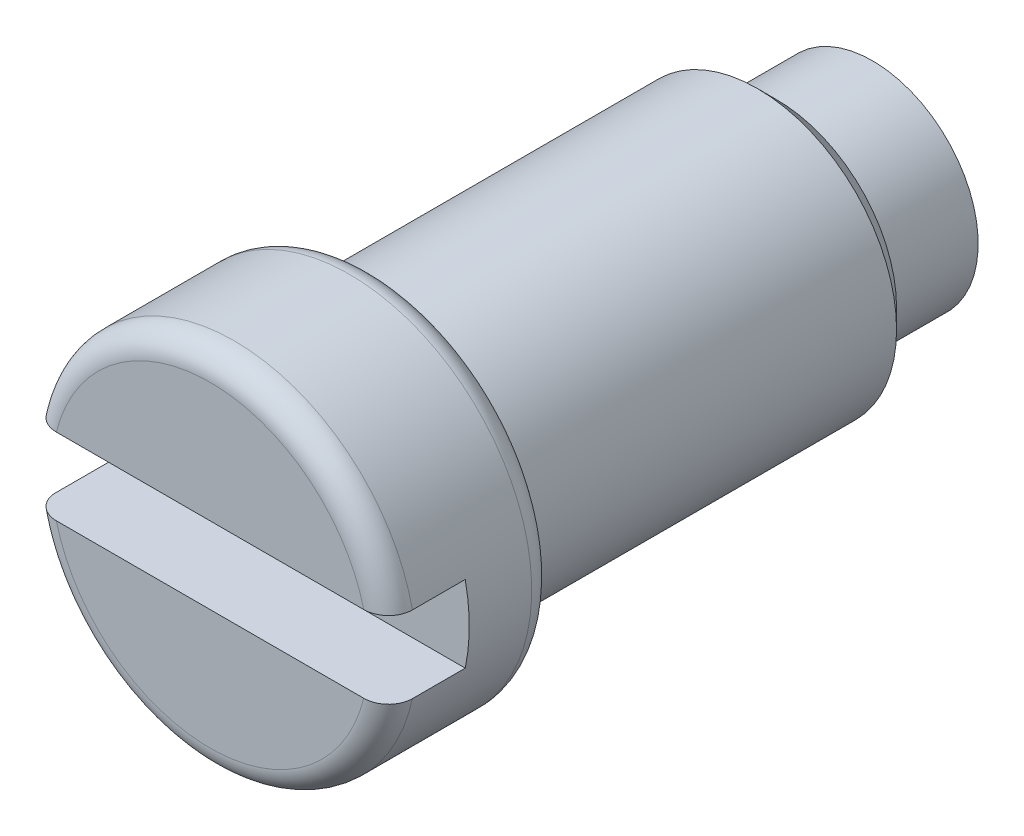
ISO-10303-21;
HEADER;
FILE_DESCRIPTION(('STEP AP214'),'2;1');
FILE_NAME('part.step','',(''),(''),'','','');
FILE_SCHEMA(('AUTOMOTIVE_DESIGN { 1 0 10303 214 1 1 1 1 }'));
ENDSEC;
DATA;
#1=APPLICATION_CONTEXT('core data for automotive mechanical design processes');
#2=APPLICATION_PROTOCOL_DEFINITION('international standard','automotive_design',2000,#1);
#3=PRODUCT_CONTEXT('',#1,'mechanical');
#4=PRODUCT('Part','Part','',(#3));
#5=PRODUCT_RELATED_PRODUCT_CATEGORY('part','',(#4));
#6=PRODUCT_DEFINITION_FORMATION('','',#4);
#7=PRODUCT_DEFINITION_CONTEXT('part definition',#1,'design');
#8=PRODUCT_DEFINITION('design','',#6,#7);
#9=PRODUCT_DEFINITION_SHAPE('','',#8);
#10=(LENGTH_UNIT() NAMED_UNIT(*) SI_UNIT(.MILLI.,.METRE.));
#11=(NAMED_UNIT(*) PLANE_ANGLE_UNIT() SI_UNIT($,.RADIAN.));
#12=(NAMED_UNIT(*) SI_UNIT($,.STERADIAN.) SOLID_ANGLE_UNIT());
#13=UNCERTAINTY_MEASURE_WITH_UNIT(LENGTH_MEASURE(1.E-05),#10,'distance_accuracy_value','');
#14=(GEOMETRIC_REPRESENTATION_CONTEXT(3) GLOBAL_UNCERTAINTY_ASSIGNED_CONTEXT((#13)) GLOBAL_UNIT_ASSIGNED_CONTEXT((#10,
#11,#12)) REPRESENTATION_CONTEXT('',''));
#15=CARTESIAN_POINT('',(0.,0.,0.));
#16=DIRECTION('',(0.,0.,1.));
#17=DIRECTION('',(1.,0.,0.));
#18=AXIS2_PLACEMENT_3D('',#15,#16,#17);
#19=CARTESIAN_POINT('',(-2.5,4.6,9.513026051264));
#20=DIRECTION('',(0.,0.,-1.));
#21=DIRECTION('',(-1.,0.,0.));
#22=AXIS2_PLACEMENT_3D('',#19,#20,#21);
#23=PLANE('',#22);
#24=CARTESIAN_POINT('',(-2.5,4.6,9.513026051264));
#25=DIRECTION('',(0.,0.,-1.));
#26=DIRECTION('',(-1.,0.,0.));
#27=AXIS2_PLACEMENT_3D('',#24,#25,#26);
#28=CIRCLE('',#27,1.9);
#29=CARTESIAN_POINT('',(-0.642582437899165,5.,9.513026051264));
#30=VERTEX_POINT('',#29);
#31=CARTESIAN_POINT('',(-0.642582437899165,4.2,9.513026051264));
#32=VERTEX_POINT('',#31);
#33=EDGE_CURVE('E85',#30,#32,#28,.T.);
#34=ORIENTED_EDGE('',*,*,#33,.F.);
#35=DIRECTION('',(1.,0.,0.));
#36=VECTOR('',#35,1.);
#37=CARTESIAN_POINT('',(-4.5,5.,9.513026051264));
#38=LINE('',#37,#36);
#39=CARTESIAN_POINT('',(-4.35741756210084,5.,9.513026051264));
#40=VERTEX_POINT('',#39);
#41=EDGE_CURVE('E87',#40,#30,#38,.T.);
#42=ORIENTED_EDGE('',*,*,#41,.F.);
#43=CARTESIAN_POINT('',(-2.5,4.6,9.513026051264));
#44=DIRECTION('',(0.,0.,-1.));
#45=DIRECTION('',(-1.,0.,0.));
#46=AXIS2_PLACEMENT_3D('',#43,#44,#45);
#47=CIRCLE('',#46,1.9);
#48=CARTESIAN_POINT('',(-4.35741756210084,4.2,9.513026051264));
#49=VERTEX_POINT('',#48);
#50=EDGE_CURVE('E20',#49,#40,#47,.T.);
#51=ORIENTED_EDGE('',*,*,#50,.F.);
#52=DIRECTION('',(-1.,0.,0.));
#53=VECTOR('',#52,1.);
#54=CARTESIAN_POINT('',(-0.5,4.2,9.513026051264));
#55=LINE('',#54,#53);
#56=EDGE_CURVE('E107',#32,#49,#55,.T.);
#57=ORIENTED_EDGE('',*,*,#56,.F.);
#58=EDGE_LOOP('',(#34,#42,#51,#57));
#59=FACE_BOUND('',#58,.T.);
#60=ADVANCED_FACE('F16',(#59),#23,.F.);
#61=CARTESIAN_POINT('',(-0.5,4.2,9.513026051264));
#62=DIRECTION('',(0.,1.,0.));
#63=DIRECTION('',(-1.,0.,0.));
#64=AXIS2_PLACEMENT_3D('',#61,#62,#63);
#65=PLANE('',#64);
#66=CARTESIAN_POINT('',(-0.899218940641806,4.2,10.3130260512637));
#67=CARTESIAN_POINT('',(-0.88447312314856,4.2,10.313037144346));
#68=CARTESIAN_POINT('',(-0.869726664546941,4.2,10.3117986365551));
#69=CARTESIAN_POINT('',(-0.840641662037422,4.2,10.3068872802437));
#70=CARTESIAN_POINT('',(-0.826303207865821,4.2,10.303213900449));
#71=CARTESIAN_POINT('',(-0.79843701500635,4.2,10.2934931109897));
#72=CARTESIAN_POINT('',(-0.784910057216155,4.2,10.2874434555903));
#73=CARTESIAN_POINT('',(-0.759094263590366,4.2,10.2731233730628));
#74=CARTESIAN_POINT('',(-0.746804813265735,4.2,10.2648540556689));
#75=CARTESIAN_POINT('',(-0.724038752934265,4.2,10.2464697612604));
#76=CARTESIAN_POINT('',(-0.713534804318365,4.2,10.236388660097));
#77=CARTESIAN_POINT('',(-0.694419251669464,4.2,10.2145623590513));
#78=CARTESIAN_POINT('',(-0.685807943175291,4.2,10.202816899747));
#79=CARTESIAN_POINT('',(-0.670952806041116,4.2,10.1783164280296));
#80=CARTESIAN_POINT('',(-0.664655221086468,4.2,10.16559395529));
#81=CARTESIAN_POINT('',(-0.654338662829457,4.2,10.1392621516275));
#82=CARTESIAN_POINT('',(-0.650317565097668,4.2,10.1256536608115));
#83=CARTESIAN_POINT('',(-0.645864357957129,4.2,10.1037824776998));
#84=CARTESIAN_POINT('',(-0.644634227561519,4.2,10.0956741556066));
#85=CARTESIAN_POINT('',(-0.642993586780836,4.2,10.0793872042961));
#86=CARTESIAN_POINT('',(-0.642581861490174,4.2,10.0712086974215));
#87=CARTESIAN_POINT('',(-0.642582437898781,4.2,10.0630260512636));
#88=B_SPLINE_CURVE_WITH_KNOTS('',3,(#66,#67,#68,#69,#70,#71,#72,#73,#74,#75,#76,#77,#78,#79,#80,
#81,#82,#83,#84,#85,#86,#87),.UNSPECIFIED.,.F.,.F.,(4,2,2,2,2,2,2,2,2,2,4),(0.,
0.044186933149632,0.0883835107904894,0.132621957953736,0.176838328888893,0.220300739142021,
0.263769931306879,0.3061534845631,0.348497419797681,0.373063391031489,0.397592867268908),.UNSPECIFIED.);
#89=CARTESIAN_POINT('',(-0.899218940641903,4.2,10.3130260512637));
#90=VERTEX_POINT('',#89);
#91=CARTESIAN_POINT('',(-0.642582437899165,4.2,10.063026051264));
#92=VERTEX_POINT('',#91);
#93=EDGE_CURVE('E105',#90,#92,#88,.T.);
#94=ORIENTED_EDGE('',*,*,#93,.T.);
#95=DIRECTION('',(0.,0.,1.));
#96=VECTOR('',#95,1.);
#97=CARTESIAN_POINT('',(-0.642582437899,4.2,9.513026051264));
#98=LINE('',#97,#96);
#99=EDGE_CURVE('E98',#92,#32,#98,.F.);
#100=ORIENTED_EDGE('',*,*,#99,.T.);
#101=ORIENTED_EDGE('',*,*,#56,.T.);
#102=DIRECTION('',(0.,0.,1.));
#103=VECTOR('',#102,1.);
#104=CARTESIAN_POINT('',(-4.357417562101,4.2,9.513026051264));
#105=LINE('',#104,#103);
#106=CARTESIAN_POINT('',(-4.35741756210088,4.2,10.0630260512635));
#107=VERTEX_POINT('',#106);
#108=EDGE_CURVE('E81',#49,#107,#105,.T.);
#109=ORIENTED_EDGE('',*,*,#108,.T.);
#110=CARTESIAN_POINT('',(-4.35741756210075,4.2,10.063026051263));
#111=CARTESIAN_POINT('',(-4.35743064349662,4.2,10.0768534439318));
#112=CARTESIAN_POINT('',(-4.35624491994685,4.2,10.0906756402485));
#113=CARTESIAN_POINT('',(-4.35157430283897,4.2,10.1179073219119));
#114=CARTESIAN_POINT('',(-4.34809255191639,4.2,10.1313173451905));
#115=CARTESIAN_POINT('',(-4.33892651719286,4.2,10.1573659647133));
#116=CARTESIAN_POINT('',(-4.33324160193866,4.2,10.1700043385904));
#117=CARTESIAN_POINT('',(-4.31985000896061,4.2,10.1941581758333));
#118=CARTESIAN_POINT('',(-4.31214336384667,4.2,10.2056736573069));
#119=CARTESIAN_POINT('',(-4.29486257387961,4.2,10.2273730850821));
#120=CARTESIAN_POINT('',(-4.28527245531423,4.2,10.2375443010645));
#121=CARTESIAN_POINT('',(-4.26455140863786,4.2,10.2561745008366));
#122=CARTESIAN_POINT('',(-4.2534201697458,4.2,10.2646331384198));
#123=CARTESIAN_POINT('',(-4.22968085064145,4.2,10.2797941125335));
#124=CARTESIAN_POINT('',(-4.21704608856897,4.2,10.286454618718));
#125=CARTESIAN_POINT('',(-4.19085734578955,4.2,10.2976174026561));
#126=CARTESIAN_POINT('',(-4.17730350910966,4.2,10.3021200176822));
#127=CARTESIAN_POINT('',(-4.15322235167703,4.2,10.3080010555842));
#128=CARTESIAN_POINT('',(-4.14281531442657,4.2,10.3098855908445));
#129=CARTESIAN_POINT('',(-4.12186674090448,4.2,10.3123980618592));
#130=CARTESIAN_POINT('',(-4.11132543509076,4.2,10.3130279181494));
#131=CARTESIAN_POINT('',(-4.10078105935821,4.2,10.3130260512637));
#132=B_SPLINE_CURVE_WITH_KNOTS('',3,(#110,#111,#112,#113,#114,#115,#116,#117,#118,#119,#120,
#121,#122,#123,#124,#125,#126,#127,#128,#129,#130,#131),.UNSPECIFIED.,.F.,.F.,(4,2,2,2,2,2,2,2,
2,2,4),(0.,0.0414236728606154,0.0827907653599118,0.124169722941349,0.165548013133184,
0.207293695140768,0.249047807843514,0.291702781648335,0.334351086424403,0.366007673767764,
0.397615767053144),.UNSPECIFIED.);
#133=CARTESIAN_POINT('',(-4.10078105935828,4.2,10.3130260512637));
#134=VERTEX_POINT('',#133);
#135=EDGE_CURVE('E106',#107,#134,#132,.T.);
#136=ORIENTED_EDGE('',*,*,#135,.T.);
#137=DIRECTION('',(-1.,0.,0.));
#138=VECTOR('',#137,1.);
#139=CARTESIAN_POINT('',(-2.5,4.2,10.313026051264));
#140=LINE('',#139,#138);
#141=EDGE_CURVE('E137',#134,#90,#140,.F.);
#142=ORIENTED_EDGE('',*,*,#141,.T.);
#143=EDGE_LOOP('',(#94,#100,#101,#109,#136,#142));
#144=FACE_BOUND('',#143,.T.);
#145=ADVANCED_FACE('F167',(#144),#65,.T.);
#146=CARTESIAN_POINT('',(-4.5,5.,9.513026051264));
#147=DIRECTION('',(0.,-1.,0.));
#148=DIRECTION('',(1.,0.,0.));
#149=AXIS2_PLACEMENT_3D('',#146,#147,#148);
#150=PLANE('',#149);
#151=CARTESIAN_POINT('',(-0.64258243790062,5.,10.063026051264));
#152=CARTESIAN_POINT('',(-0.642569356504808,5.,10.0768534439328));
#153=CARTESIAN_POINT('',(-0.643755080054645,5.,10.0906756402496));
#154=CARTESIAN_POINT('',(-0.648425697162642,5.,10.117907321913));
#155=CARTESIAN_POINT('',(-0.651907448085279,5.,10.1313173451915));
#156=CARTESIAN_POINT('',(-0.661073482808934,5.,10.1573659647144));
#157=CARTESIAN_POINT('',(-0.666758398063187,5.,10.1700043385915));
#158=CARTESIAN_POINT('',(-0.680149991041358,5.,10.1941581758343));
#159=CARTESIAN_POINT('',(-0.687856636155357,5.,10.2056736573079));
#160=CARTESIAN_POINT('',(-0.705137426122528,5.,10.227373085083));
#161=CARTESIAN_POINT('',(-0.714727544687964,5.,10.2375443010655));
#162=CARTESIAN_POINT('',(-0.735448591364448,5.,10.2561745008375));
#163=CARTESIAN_POINT('',(-0.746579830256557,5.,10.2646331384206));
#164=CARTESIAN_POINT('',(-0.770319149361005,5.,10.2797941125343));
#165=CARTESIAN_POINT('',(-0.782953911433531,5.,10.2864546187187));
#166=CARTESIAN_POINT('',(-0.809142654213031,5.,10.2976174026568));
#167=CARTESIAN_POINT('',(-0.822696490892963,5.,10.3021200176828));
#168=CARTESIAN_POINT('',(-0.84677764832523,5.,10.3080010555846));
#169=CARTESIAN_POINT('',(-0.85718468557528,5.,10.3098855908449));
#170=CARTESIAN_POINT('',(-0.878133259096544,5.,10.3123980618594));
#171=CARTESIAN_POINT('',(-0.888674564909842,5.,10.3130279181497));
#172=CARTESIAN_POINT('',(-0.89921894064198,5.,10.313026051264));
#173=B_SPLINE_CURVE_WITH_KNOTS('',3,(#151,#152,#153,#154,#155,#156,#157,#158,#159,#160,#161,
#162,#163,#164,#165,#166,#167,#168,#169,#170,#171,#172),.UNSPECIFIED.,.F.,.F.,(4,2,2,2,2,2,2,2,
2,2,4),(0.,0.0414236728606735,0.0827907653600285,0.124169722941522,0.165548013133419,
0.207293695141062,0.249047807843868,0.29170278164875,0.334351086424873,0.366007673766991,
0.397615767051126),.UNSPECIFIED.);
#174=CARTESIAN_POINT('',(-0.64258243789981,5.,10.063026051264));
#175=VERTEX_POINT('',#174);
#176=CARTESIAN_POINT('',(-0.899218940642508,5.,10.313026051264));
#177=VERTEX_POINT('',#176);
#178=EDGE_CURVE('E132',#175,#177,#173,.T.);
#179=ORIENTED_EDGE('',*,*,#178,.T.);
#180=DIRECTION('',(-1.,0.,0.));
#181=VECTOR('',#180,1.);
#182=CARTESIAN_POINT('',(-2.5,5.,10.313026051264));
#183=LINE('',#182,#181);
#184=CARTESIAN_POINT('',(-4.10078105935801,5.,10.3130260512639));
#185=VERTEX_POINT('',#184);
#186=EDGE_CURVE('E131',#177,#185,#183,.T.);
#187=ORIENTED_EDGE('',*,*,#186,.T.);
#188=CARTESIAN_POINT('',(-4.10078105935802,5.,10.3130260512639));
#189=CARTESIAN_POINT('',(-4.11552687685127,5.,10.3130371443462));
#190=CARTESIAN_POINT('',(-4.13027333545289,5.,10.3117986365553));
#191=CARTESIAN_POINT('',(-4.15935833796241,5.,10.3068872802438));
#192=CARTESIAN_POINT('',(-4.17369679213401,5.,10.3032139004491));
#193=CARTESIAN_POINT('',(-4.20156298499348,5.,10.2934931109898));
#194=CARTESIAN_POINT('',(-4.21508994278367,5.,10.2874434555903));
#195=CARTESIAN_POINT('',(-4.24090573640945,5.,10.2731233730628));
#196=CARTESIAN_POINT('',(-4.25319518673408,5.,10.2648540556689));
#197=CARTESIAN_POINT('',(-4.27596124706553,5.,10.2464697612604));
#198=CARTESIAN_POINT('',(-4.28646519568143,5.,10.236388660097));
#199=CARTESIAN_POINT('',(-4.30558074833031,5.,10.2145623590512));
#200=CARTESIAN_POINT('',(-4.31419205682448,5.,10.2028168997469));
#201=CARTESIAN_POINT('',(-4.32904719395864,5.,10.1783164280295));
#202=CARTESIAN_POINT('',(-4.33534477891327,5.,10.1655939552899));
#203=CARTESIAN_POINT('',(-4.34566133717027,5.,10.1392621516273));
#204=CARTESIAN_POINT('',(-4.34968243490205,5.,10.1256536608114));
#205=CARTESIAN_POINT('',(-4.35413564204254,5.,10.1037824776997));
#206=CARTESIAN_POINT('',(-4.35536577243813,5.,10.0956741556066));
#207=CARTESIAN_POINT('',(-4.3570064132188,5.,10.0793872042964));
#208=CARTESIAN_POINT('',(-4.35741813850947,5.,10.0712086974219));
#209=CARTESIAN_POINT('',(-4.35741756210088,5.,10.0630260512641));
#210=B_SPLINE_CURVE_WITH_KNOTS('',3,(#188,#189,#190,#191,#192,#193,#194,#195,#196,#197,#198,
#199,#200,#201,#202,#203,#204,#205,#206,#207,#208,#209),.UNSPECIFIED.,.F.,.F.,(4,2,2,2,2,2,2,2,
2,2,4),(0.,0.0441869331496441,0.0883835107905131,0.132621957953773,0.17683832888894,
0.220300739142085,0.26376993130696,0.306153484563207,0.348497419797815,0.373063391031278,
0.397592867268352),.UNSPECIFIED.);
#211=CARTESIAN_POINT('',(-4.35741756210084,5.,10.063026051264));
#212=VERTEX_POINT('',#211);
#213=EDGE_CURVE('E96',#185,#212,#210,.T.);
#214=ORIENTED_EDGE('',*,*,#213,.T.);
#215=DIRECTION('',(0.,0.,1.));
#216=VECTOR('',#215,1.);
#217=CARTESIAN_POINT('',(-4.357417562101,5.,9.513026051264));
#218=LINE('',#217,#216);
#219=EDGE_CURVE('E77',#212,#40,#218,.F.);
#220=ORIENTED_EDGE('',*,*,#219,.T.);
#221=ORIENTED_EDGE('',*,*,#41,.T.);
#222=DIRECTION('',(0.,0.,1.));
#223=VECTOR('',#222,1.);
#224=CARTESIAN_POINT('',(-0.642582437899,5.,9.513026051264));
#225=LINE('',#224,#223);
#226=EDGE_CURVE('E91',#30,#175,#225,.T.);
#227=ORIENTED_EDGE('',*,*,#226,.T.);
#228=EDGE_LOOP('',(#179,#187,#214,#220,#221,#227));
#229=FACE_BOUND('',#228,.T.);
#230=ADVANCED_FACE('F93',(#229),#150,.T.);
#231=CARTESIAN_POINT('',(-2.5,4.6,10.313026051264));
#232=DIRECTION('',(0.,0.,-1.));
#233=DIRECTION('',(-1.,0.,0.));
#234=AXIS2_PLACEMENT_3D('',#231,#232,#233);
#235=PLANE('',#234);
#236=CARTESIAN_POINT('',(-2.49999999999999,4.60000000000019,10.3130260512637));
#237=DIRECTION('',(0.,0.,-1.));
#238=DIRECTION('',(-1.,0.,0.));
#239=AXIS2_PLACEMENT_3D('',#236,#237,#238);
#240=CIRCLE('',#239,1.65000000000019);
#241=EDGE_CURVE('E128',#90,#134,#240,.T.);
#242=ORIENTED_EDGE('',*,*,#241,.F.);
#243=ORIENTED_EDGE('',*,*,#141,.F.);
#244=EDGE_LOOP('',(#242,#243));
#245=FACE_BOUND('',#244,.T.);
#246=ADVANCED_FACE('F177',(#245),#235,.F.);
#247=CARTESIAN_POINT('',(-2.5,4.6,10.313026051264));
#248=DIRECTION('',(0.,0.,-1.));
#249=DIRECTION('',(-1.,0.,0.));
#250=AXIS2_PLACEMENT_3D('',#247,#248,#249);
#251=PLANE('',#250);
#252=CARTESIAN_POINT('',(-2.5,4.6000000000016,10.313026051264));
#253=DIRECTION('',(0.,0.,-1.));
#254=DIRECTION('',(-1.,0.,0.));
#255=AXIS2_PLACEMENT_3D('',#252,#253,#254);
#256=CIRCLE('',#255,1.6499999999984);
#257=EDGE_CURVE('E124',#185,#177,#256,.T.);
#258=ORIENTED_EDGE('',*,*,#257,.F.);
#259=ORIENTED_EDGE('',*,*,#186,.F.);
#260=EDGE_LOOP('',(#258,#259));
#261=FACE_BOUND('',#260,.T.);
#262=ADVANCED_FACE('F157',(#261),#251,.F.);
#263=CARTESIAN_POINT('',(-2.49999999999999,4.60000000000019,10.063026051264));
#264=DIRECTION('',(0.,0.,-1.));
#265=DIRECTION('',(-1.,0.,0.));
#266=AXIS2_PLACEMENT_3D('',#263,#264,#265);
#267=TOROIDAL_SURFACE('',#266,1.65000000000042,0.249999999999708);
#268=ORIENTED_EDGE('',*,*,#93,.F.);
#269=ORIENTED_EDGE('',*,*,#241,.T.);
#270=ORIENTED_EDGE('',*,*,#135,.F.);
#271=CARTESIAN_POINT('',(-2.5,4.6,10.063026051264));
#272=DIRECTION('',(0.,0.,-1.));
#273=DIRECTION('',(-1.,0.,0.));
#274=AXIS2_PLACEMENT_3D('',#271,#272,#273);
#275=CIRCLE('',#274,1.9);
#276=EDGE_CURVE('E127',#92,#107,#275,.T.);
#277=ORIENTED_EDGE('',*,*,#276,.F.);
#278=EDGE_LOOP('',(#268,#269,#270,#277));
#279=FACE_BOUND('',#278,.T.);
#280=ADVANCED_FACE('F150',(#279),#267,.T.);
#281=CARTESIAN_POINT('',(-2.5,4.6000000000016,10.063026051264));
#282=DIRECTION('',(0.,0.,-1.));
#283=DIRECTION('',(-1.,0.,0.));
#284=AXIS2_PLACEMENT_3D('',#281,#282,#283);
#285=TOROIDAL_SURFACE('',#284,1.64999999999841,0.249999999999998);
#286=ORIENTED_EDGE('',*,*,#257,.T.);
#287=ORIENTED_EDGE('',*,*,#178,.F.);
#288=CARTESIAN_POINT('',(-2.5,4.6,10.063026051264));
#289=DIRECTION('',(0.,0.,-1.));
#290=DIRECTION('',(-1.,0.,0.));
#291=AXIS2_PLACEMENT_3D('',#288,#289,#290);
#292=CIRCLE('',#291,1.9);
#293=EDGE_CURVE('E123',#212,#175,#292,.T.);
#294=ORIENTED_EDGE('',*,*,#293,.F.);
#295=ORIENTED_EDGE('',*,*,#213,.F.);
#296=EDGE_LOOP('',(#286,#287,#294,#295));
#297=FACE_BOUND('',#296,.T.);
#298=ADVANCED_FACE('F146',(#297),#285,.T.);
#299=CARTESIAN_POINT('',(-2.5,4.6,3.413026051264));
#300=DIRECTION('',(0.,0.,-1.));
#301=DIRECTION('',(-1.,0.,0.));
#302=AXIS2_PLACEMENT_3D('',#299,#300,#301);
#303=PLANE('',#302);
#304=CARTESIAN_POINT('',(-2.5,4.6,3.413026051264));
#305=DIRECTION('',(0.,0.,-1.));
#306=DIRECTION('',(-1.,0.,0.));
#307=AXIS2_PLACEMENT_3D('',#304,#305,#306);
#308=CIRCLE('',#307,1.1);
#309=CARTESIAN_POINT('',(-3.6,4.6,3.413026051264));
#310=VERTEX_POINT('',#309);
#311=EDGE_CURVE('E120',#310,#310,#308,.F.);
#312=ORIENTED_EDGE('',*,*,#311,.F.);
#313=EDGE_LOOP('',(#312));
#314=FACE_BOUND('',#313,.T.);
#315=ADVANCED_FACE('F149',(#314),#303,.T.);
#316=CARTESIAN_POINT('',(-2.5,4.6,10.313026051264));
#317=DIRECTION('',(0.,0.,-1.));
#318=DIRECTION('',(-1.,0.,0.));
#319=AXIS2_PLACEMENT_3D('',#316,#317,#318);
#320=CYLINDRICAL_SURFACE('',#319,1.9);
#321=CARTESIAN_POINT('',(-2.5,4.6,8.863026051264));
#322=DIRECTION('',(0.,0.,-1.));
#323=DIRECTION('',(-1.,0.,0.));
#324=AXIS2_PLACEMENT_3D('',#321,#322,#323);
#325=CIRCLE('',#324,1.9);
#326=CARTESIAN_POINT('',(-4.4,4.6,8.863026051264));
#327=VERTEX_POINT('',#326);
#328=EDGE_CURVE('E119',#327,#327,#325,.T.);
#329=ORIENTED_EDGE('',*,*,#328,.F.);
#330=EDGE_LOOP('',(#329));
#331=FACE_BOUND('',#330,.T.);
#332=ORIENTED_EDGE('',*,*,#293,.T.);
#333=ORIENTED_EDGE('',*,*,#226,.F.);
#334=ORIENTED_EDGE('',*,*,#33,.T.);
#335=ORIENTED_EDGE('',*,*,#99,.F.);
#336=ORIENTED_EDGE('',*,*,#276,.T.);
#337=ORIENTED_EDGE('',*,*,#108,.F.);
#338=ORIENTED_EDGE('',*,*,#50,.T.);
#339=ORIENTED_EDGE('',*,*,#219,.F.);
#340=EDGE_LOOP('',(#332,#333,#334,#335,#336,#337,#338,#339));
#341=FACE_BOUND('',#340,.T.);
#342=ADVANCED_FACE('F75',(#331,#341),#320,.T.);
#343=CARTESIAN_POINT('',(-2.5,4.6,4.413026051264));
#344=DIRECTION('',(0.,0.,-1.));
#345=DIRECTION('',(-1.,0.,0.));
#346=AXIS2_PLACEMENT_3D('',#343,#344,#345);
#347=CYLINDRICAL_SURFACE('',#346,1.1);
#348=ORIENTED_EDGE('',*,*,#311,.T.);
#349=EDGE_LOOP('',(#348));
#350=FACE_BOUND('',#349,.T.);
#351=CARTESIAN_POINT('',(-2.5,4.6,4.413026051264));
#352=DIRECTION('',(0.,0.,-1.));
#353=DIRECTION('',(-1.,0.,0.));
#354=AXIS2_PLACEMENT_3D('',#351,#352,#353);
#355=CIRCLE('',#354,1.1);
#356=CARTESIAN_POINT('',(-3.6,4.6,4.413026051264));
#357=VERTEX_POINT('',#356);
#358=EDGE_CURVE('E115',#357,#357,#355,.T.);
#359=ORIENTED_EDGE('',*,*,#358,.T.);
#360=EDGE_LOOP('',(#359));
#361=FACE_BOUND('',#360,.T.);
#362=ADVANCED_FACE('F212',(#350,#361),#347,.T.);
#363=CARTESIAN_POINT('',(-2.5,4.6,8.863026051264));
#364=DIRECTION('',(0.,0.,-1.));
#365=DIRECTION('',(-1.,0.,0.));
#366=AXIS2_PLACEMENT_3D('',#363,#364,#365);
#367=TOROIDAL_SURFACE('',#366,1.65,0.25);
#368=ORIENTED_EDGE('',*,*,#328,.T.);
#369=EDGE_LOOP('',(#368));
#370=FACE_BOUND('',#369,.T.);
#371=CARTESIAN_POINT('',(-2.5,2.95,8.613026051264));
#372=CARTESIAN_POINT('',(-2.81424249801971,2.95,8.613026051264));
#373=CARTESIAN_POINT('',(-3.10735627077756,3.065849303247,8.613026051264));
#374=CARTESIAN_POINT('',(-3.42424707065306,3.19109615884696,8.613026051264));
#375=CARTESIAN_POINT('',(-3.66672618895767,3.43327381104233,8.613026051264));
#376=CARTESIAN_POINT('',(-3.90776293028857,3.67401087952265,8.613026051264));
#377=CARTESIAN_POINT('',(-4.03415069675306,3.99264372922288,8.613026051264));
#378=CARTESIAN_POINT('',(-4.14980409067676,4.28421443669137,8.613026051264));
#379=CARTESIAN_POINT('',(-4.14999999999967,4.60000000000033,8.613026051264));
#380=CARTESIAN_POINT('',(-4.15019464649818,4.9137500210031,8.613026051264));
#381=CARTESIAN_POINT('',(-4.034150696753,5.20735627077756,8.613026051264));
#382=CARTESIAN_POINT('',(-3.90890383841103,5.52424707339648,8.613026051264));
#383=CARTESIAN_POINT('',(-3.666726188958,5.76672618895767,8.613026051264));
#384=CARTESIAN_POINT('',(-3.42598894476354,6.00776310622378,8.613026051264));
#385=CARTESIAN_POINT('',(-3.10735627077729,6.13415069675294,8.613026051264));
#386=CARTESIAN_POINT('',(-2.81529141600394,6.25,8.613026051264));
#387=CARTESIAN_POINT('',(-2.5,6.25,8.613026051264));
#388=B_SPLINE_CURVE_WITH_KNOTS('',2,(#371,#372,#373,#374,#375,#376,#377,#378,#379,#380,#381,
#382,#383,#384,#385,#386,#387),.UNSPECIFIED.,.F.,.F.,(3,2,2,2,2,2,2,2,3),(0.,0.125,0.25,0.375,
0.5,0.625,0.75,0.875,1.),.UNSPECIFIED.);
#389=CARTESIAN_POINT('',(-2.5,2.95,8.613026051264));
#390=VERTEX_POINT('',#389);
#391=CARTESIAN_POINT('',(-2.5,6.25,8.613026051264));
#392=VERTEX_POINT('',#391);
#393=EDGE_CURVE('E34',#390,#392,#388,.T.);
#394=ORIENTED_EDGE('',*,*,#393,.F.);
#395=CARTESIAN_POINT('',(-2.5,6.25,8.613026051264));
#396=CARTESIAN_POINT('',(-2.18575750197995,6.25,8.613026051264));
#397=CARTESIAN_POINT('',(-1.89264372922244,6.134150696753,8.613026051264));
#398=CARTESIAN_POINT('',(-1.57575292934719,6.00890384115299,8.613026051264));
#399=CARTESIAN_POINT('',(-1.33327381104233,5.76672618895767,8.613026051264));
#400=CARTESIAN_POINT('',(-1.09223706971344,5.52598912047965,8.613026051264));
#401=CARTESIAN_POINT('',(-0.965849303246941,5.20735627077718,8.613026051264));
#402=CARTESIAN_POINT('',(-0.850195909323312,4.91578556331146,8.613026051264));
#403=CARTESIAN_POINT('',(-0.850000000000333,4.60000000000033,8.613026051264));
#404=CARTESIAN_POINT('',(-0.849805353501757,4.28624997899583,8.613026051264));
#405=CARTESIAN_POINT('',(-0.965849303247,3.99264372922256,8.613026051264));
#406=CARTESIAN_POINT('',(-1.09109616159122,3.67575292659941,8.613026051264));
#407=CARTESIAN_POINT('',(-1.33327381104233,3.43327381104233,8.613026051264));
#408=CARTESIAN_POINT('',(-1.57401105524077,3.19223689377442,8.613026051264));
#409=CARTESIAN_POINT('',(-1.89264372922271,3.06584930324706,8.613026051264));
#410=CARTESIAN_POINT('',(-2.18470858399626,2.95,8.613026051264));
#411=CARTESIAN_POINT('',(-2.5,2.95,8.613026051264));
#412=B_SPLINE_CURVE_WITH_KNOTS('',2,(#395,#396,#397,#398,#399,#400,#401,#402,#403,#404,#405,
#406,#407,#408,#409,#410,#411),.UNSPECIFIED.,.F.,.F.,(3,2,2,2,2,2,2,2,3),(0.,0.125,0.25,0.375,
0.5,0.625,0.75,0.875,1.),.UNSPECIFIED.);
#413=EDGE_CURVE('E118',#392,#390,#412,.T.);
#414=ORIENTED_EDGE('',*,*,#413,.F.);
#415=EDGE_LOOP('',(#394,#414));
#416=FACE_BOUND('',#415,.T.);
#417=ADVANCED_FACE('F18',(#370,#416),#367,.T.);
#418=CARTESIAN_POINT('',(-2.5,4.6,4.413026051264));
#419=DIRECTION('',(0.,0.,1.));
#420=DIRECTION('',(1.,0.,0.));
#421=AXIS2_PLACEMENT_3D('',#418,#419,#420);
#422=PLANE('',#421);
#423=CARTESIAN_POINT('',(-2.5,4.6,4.41302605139526));
#424=DIRECTION('',(0.,0.,1.));
#425=DIRECTION('',(1.,0.,0.));
#426=AXIS2_PLACEMENT_3D('',#423,#424,#425);
#427=CIRCLE('',#426,1.2500000000864);
#428=CARTESIAN_POINT('',(-1.2499999999136,4.6,4.41302605139526));
#429=VERTEX_POINT('',#428);
#430=EDGE_CURVE('E112',#429,#429,#427,.T.);
#431=ORIENTED_EDGE('',*,*,#430,.F.);
#432=EDGE_LOOP('',(#431));
#433=FACE_BOUND('',#432,.T.);
#434=ORIENTED_EDGE('',*,*,#358,.F.);
#435=EDGE_LOOP('',(#434));
#436=FACE_BOUND('',#435,.T.);
#437=ADVANCED_FACE('F195',(#433,#436),#422,.F.);
#438=CARTESIAN_POINT('',(-2.5,4.6,8.613026051264));
#439=DIRECTION('',(0.,0.,-1.));
#440=DIRECTION('',(-1.,0.,0.));
#441=AXIS2_PLACEMENT_3D('',#438,#439,#440);
#442=PLANE('',#441);
#443=ORIENTED_EDGE('',*,*,#413,.T.);
#444=ORIENTED_EDGE('',*,*,#393,.T.);
#445=EDGE_LOOP('',(#443,#444));
#446=FACE_BOUND('',#445,.T.);
#447=CARTESIAN_POINT('',(-2.5,4.6,8.613026051264));
#448=DIRECTION('',(0.,0.,-1.));
#449=DIRECTION('',(-1.,0.,0.));
#450=AXIS2_PLACEMENT_3D('',#447,#448,#449);
#451=CIRCLE('',#450,1.45);
#452=CARTESIAN_POINT('',(-3.95,4.6,8.613026051264));
#453=VERTEX_POINT('',#452);
#454=EDGE_CURVE('E26',#453,#453,#451,.T.);
#455=ORIENTED_EDGE('',*,*,#454,.F.);
#456=EDGE_LOOP('',(#455));
#457=FACE_BOUND('',#456,.T.);
#458=ADVANCED_FACE('F187',(#446,#457),#442,.T.);
#459=CARTESIAN_POINT('',(-2.5,4.6,4.61302605123137));
#460=DIRECTION('',(0.,0.,1.));
#461=DIRECTION('',(1.,0.,0.));
#462=AXIS2_PLACEMENT_3D('',#459,#460,#461);
#463=CONICAL_SURFACE('',#462,1.44999999992251,0.785398163397448);
#464=CARTESIAN_POINT('',(-2.5,4.6,4.613026051264));
#465=DIRECTION('',(0.,0.,-1.));
#466=DIRECTION('',(-1.,0.,0.));
#467=AXIS2_PLACEMENT_3D('',#464,#465,#466);
#468=CIRCLE('',#467,1.45);
#469=CARTESIAN_POINT('',(-3.95,4.6,4.613026051264));
#470=VERTEX_POINT('',#469);
#471=EDGE_CURVE('E11',#470,#470,#468,.F.);
#472=ORIENTED_EDGE('',*,*,#471,.F.);
#473=EDGE_LOOP('',(#472));
#474=FACE_BOUND('',#473,.T.);
#475=ORIENTED_EDGE('',*,*,#430,.T.);
#476=EDGE_LOOP('',(#475));
#477=FACE_BOUND('',#476,.T.);
#478=ADVANCED_FACE('F181',(#474,#477),#463,.T.);
#479=CARTESIAN_POINT('',(-2.5,4.6,8.613026051264));
#480=DIRECTION('',(0.,0.,-1.));
#481=DIRECTION('',(-1.,0.,0.));
#482=AXIS2_PLACEMENT_3D('',#479,#480,#481);
#483=CYLINDRICAL_SURFACE('',#482,1.45);
#484=ORIENTED_EDGE('',*,*,#471,.T.);
#485=EDGE_LOOP('',(#484));
#486=FACE_BOUND('',#485,.T.);
#487=ORIENTED_EDGE('',*,*,#454,.T.);
#488=EDGE_LOOP('',(#487));
#489=FACE_BOUND('',#488,.T.);
#490=ADVANCED_FACE('F179',(#486,#489),#483,.T.);
#491=CLOSED_SHELL('',(#60,#145,#230,#246,#262,#280,#298,#315,#342,#362,#417,#437,#458,#478,#490));
#492=MANIFOLD_SOLID_BREP('B1',#491);
#493=ADVANCED_BREP_SHAPE_REPRESENTATION('',(#18,#492),#14);
#494=SHAPE_DEFINITION_REPRESENTATION(#9,#493);
ENDSEC;
END-ISO-10303-21;
